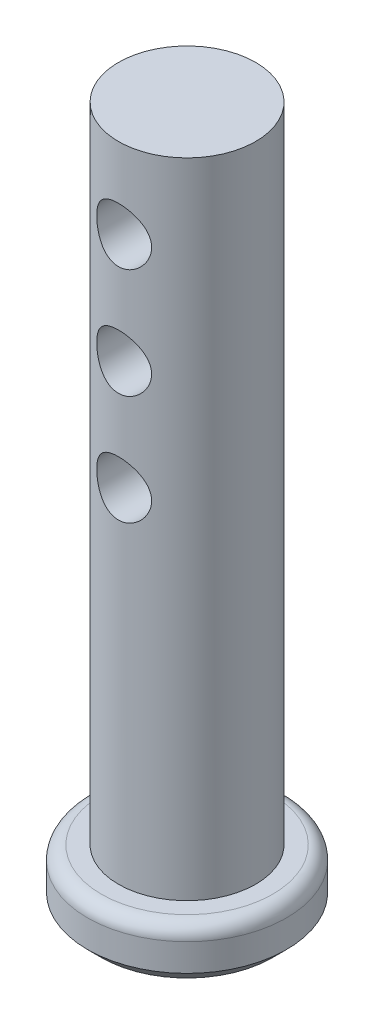
ISO-10303-21;
HEADER;
FILE_DESCRIPTION(('STEP AP214'),'2;1');
FILE_NAME('part.step','',(''),(''),'','','');
FILE_SCHEMA(('AUTOMOTIVE_DESIGN { 1 0 10303 214 1 1 1 1 }'));
ENDSEC;
DATA;
#1=APPLICATION_CONTEXT('core data for automotive mechanical design processes');
#2=APPLICATION_PROTOCOL_DEFINITION('international standard','automotive_design',2000,#1);
#3=PRODUCT_CONTEXT('',#1,'mechanical');
#4=PRODUCT('Part','Part','',(#3));
#5=PRODUCT_RELATED_PRODUCT_CATEGORY('part','',(#4));
#6=PRODUCT_DEFINITION_FORMATION('','',#4);
#7=PRODUCT_DEFINITION_CONTEXT('part definition',#1,'design');
#8=PRODUCT_DEFINITION('design','',#6,#7);
#9=PRODUCT_DEFINITION_SHAPE('','',#8);
#10=(LENGTH_UNIT() NAMED_UNIT(*) SI_UNIT(.MILLI.,.METRE.));
#11=(NAMED_UNIT(*) PLANE_ANGLE_UNIT() SI_UNIT($,.RADIAN.));
#12=(NAMED_UNIT(*) SI_UNIT($,.STERADIAN.) SOLID_ANGLE_UNIT());
#13=UNCERTAINTY_MEASURE_WITH_UNIT(LENGTH_MEASURE(1.E-05),#10,'distance_accuracy_value','');
#14=(GEOMETRIC_REPRESENTATION_CONTEXT(3) GLOBAL_UNCERTAINTY_ASSIGNED_CONTEXT((#13)) GLOBAL_UNIT_ASSIGNED_CONTEXT((#10,
#11,#12)) REPRESENTATION_CONTEXT('',''));
#15=CARTESIAN_POINT('',(0.,0.,0.));
#16=DIRECTION('',(0.,0.,1.));
#17=DIRECTION('',(1.,0.,0.));
#18=AXIS2_PLACEMENT_3D('',#15,#16,#17);
#19=CARTESIAN_POINT('',(0.,2.54,0.));
#20=DIRECTION('',(0.,1.,0.));
#21=DIRECTION('',(0.,0.,1.));
#22=AXIS2_PLACEMENT_3D('',#19,#20,#21);
#23=PLANE('',#22);
#24=CARTESIAN_POINT('',(0.,2.54,0.));
#25=DIRECTION('',(0.,1.,0.));
#26=DIRECTION('',(0.,0.,1.));
#27=AXIS2_PLACEMENT_3D('',#24,#25,#26);
#28=CIRCLE('',#27,3.96875);
#29=CARTESIAN_POINT('',(0.,2.54,3.96875));
#30=VERTEX_POINT('',#29);
#31=EDGE_CURVE('E52',#30,#30,#28,.T.);
#32=ORIENTED_EDGE('',*,*,#31,.T.);
#33=EDGE_LOOP('',(#32));
#34=FACE_BOUND('',#33,.T.);
#35=CARTESIAN_POINT('',(0.,2.54,0.));
#36=DIRECTION('',(0.,1.,0.));
#37=DIRECTION('',(0.,0.,1.));
#38=AXIS2_PLACEMENT_3D('',#35,#36,#37);
#39=CIRCLE('',#38,3.175);
#40=CARTESIAN_POINT('',(0.,2.54,3.175));
#41=VERTEX_POINT('',#40);
#42=EDGE_CURVE('E55',#41,#41,#39,.T.);
#43=ORIENTED_EDGE('',*,*,#42,.F.);
#44=EDGE_LOOP('',(#43));
#45=FACE_BOUND('',#44,.T.);
#46=ADVANCED_FACE('F35',(#34,#45),#23,.T.);
#47=CARTESIAN_POINT('',(0.,2.54,0.));
#48=DIRECTION('',(0.,-1.,0.));
#49=DIRECTION('',(0.,0.,-1.));
#50=AXIS2_PLACEMENT_3D('',#47,#48,#49);
#51=CYLINDRICAL_SURFACE('',#50,4.60375);
#52=CARTESIAN_POINT('',(0.,0.635000000000004,0.));
#53=DIRECTION('',(0.,1.,0.));
#54=DIRECTION('',(0.,0.,1.));
#55=AXIS2_PLACEMENT_3D('',#52,#53,#54);
#56=CIRCLE('',#55,4.60375);
#57=CARTESIAN_POINT('',(0.,0.635000000000004,4.60375));
#58=VERTEX_POINT('',#57);
#59=EDGE_CURVE('E43',#58,#58,#56,.T.);
#60=ORIENTED_EDGE('',*,*,#59,.T.);
#61=EDGE_LOOP('',(#60));
#62=FACE_BOUND('',#61,.T.);
#63=CARTESIAN_POINT('',(0.,1.905,0.));
#64=DIRECTION('',(0.,1.,0.));
#65=DIRECTION('',(0.,0.,1.));
#66=AXIS2_PLACEMENT_3D('',#63,#64,#65);
#67=CIRCLE('',#66,4.60375);
#68=CARTESIAN_POINT('',(0.,1.905,4.60375));
#69=VERTEX_POINT('',#68);
#70=EDGE_CURVE('E47',#69,#69,#67,.F.);
#71=ORIENTED_EDGE('',*,*,#70,.T.);
#72=EDGE_LOOP('',(#71));
#73=FACE_BOUND('',#72,.T.);
#74=ADVANCED_FACE('F126',(#62,#73),#51,.T.);
#75=CARTESIAN_POINT('',(0.,0.,0.));
#76=DIRECTION('',(0.,1.,0.));
#77=DIRECTION('',(0.,0.,1.));
#78=AXIS2_PLACEMENT_3D('',#75,#76,#77);
#79=PLANE('',#78);
#80=CARTESIAN_POINT('',(0.,0.,0.));
#81=DIRECTION('',(0.,1.,0.));
#82=DIRECTION('',(0.,0.,1.));
#83=AXIS2_PLACEMENT_3D('',#80,#81,#82);
#84=CIRCLE('',#83,3.96875);
#85=CARTESIAN_POINT('',(0.,0.,3.96875));
#86=VERTEX_POINT('',#85);
#87=EDGE_CURVE('E10',#86,#86,#84,.F.);
#88=ORIENTED_EDGE('',*,*,#87,.T.);
#89=EDGE_LOOP('',(#88));
#90=FACE_BOUND('',#89,.T.);
#91=ADVANCED_FACE('F110',(#90),#79,.F.);
#92=CARTESIAN_POINT('',(0.,48.26,0.));
#93=DIRECTION('',(0.,-1.,0.));
#94=DIRECTION('',(0.,0.,-1.));
#95=AXIS2_PLACEMENT_3D('',#92,#93,#94);
#96=CYLINDRICAL_SURFACE('',#95,3.175);
#97=CARTESIAN_POINT('',(0.,32.3205337455157,0.));
#98=DIRECTION('',(0.,-1.,0.));
#99=DIRECTION('',(0.,0.,-1.));
#100=AXIS2_PLACEMENT_3D('',#97,#98,#99);
#101=CIRCLE('',#100,3.175);
#102=CARTESIAN_POINT('',(0.,32.3205337455157,-3.175));
#103=VERTEX_POINT('',#102);
#104=EDGE_CURVE('E39',#103,#103,#101,.T.);
#105=ORIENTED_EDGE('',*,*,#104,.T.);
#106=EDGE_LOOP('',(#105));
#107=FACE_BOUND('',#106,.T.);
#108=CARTESIAN_POINT('',(0.,29.845,-3.175));
#109=CARTESIAN_POINT('',(-0.068258058456236,29.8449937440919,-3.17499537229199));
#110=CARTESIAN_POINT('',(-0.136634578197578,29.8394642274239,-3.17277301884902));
#111=CARTESIAN_POINT('',(-0.271460265065364,29.817537708264,-3.16409992718907));
#112=CARTESIAN_POINT('',(-0.337903678751393,29.8011111627803,-3.15763769473787));
#113=CARTESIAN_POINT('',(-0.466695740931903,29.7580836904327,-3.1411812285033));
#114=CARTESIAN_POINT('',(-0.529057020126772,29.7315160726524,-3.13119856591186));
#115=CARTESIAN_POINT('',(-0.648380701158518,29.6690928249377,-3.10868447855509));
#116=CARTESIAN_POINT('',(-0.705344967736885,29.6332404191265,-3.09615393885866));
#117=CARTESIAN_POINT('',(-0.815023139807206,29.5514804584138,-3.06915112718216));
#118=CARTESIAN_POINT('',(-0.867449543069393,29.5052072732875,-3.05461858550036));
#119=CARTESIAN_POINT('',(-0.964041128038309,29.4046909977923,-3.02552466335433));
#120=CARTESIAN_POINT('',(-1.0082022680298,29.3504440312706,-3.01096327228158));
#121=CARTESIAN_POINT('',(-1.08894535023099,29.2325881753962,-2.98273972791181));
#122=CARTESIAN_POINT('',(-1.12510251305914,29.1686700813753,-2.96914643637744));
#123=CARTESIAN_POINT('',(-1.18602424658861,29.0350343870033,-2.94534365963612));
#124=CARTESIAN_POINT('',(-1.21079422832153,28.9653195598163,-2.93513256790051));
#125=CARTESIAN_POINT('',(-1.2470757528564,28.825372668169,-2.91989737114619));
#126=CARTESIAN_POINT('',(-1.25913766828662,28.7553074654091,-2.91465901925808));
#127=CARTESIAN_POINT('',(-1.27137983064145,28.6139667760749,-2.90934142571205));
#128=CARTESIAN_POINT('',(-1.27156592035893,28.5426919019132,-2.90925964706956));
#129=CARTESIAN_POINT('',(-1.26046824836542,28.4062445136242,-2.91408167677795));
#130=CARTESIAN_POINT('',(-1.2499818245838,28.3409925213503,-2.91863891149414));
#131=CARTESIAN_POINT('',(-1.21916626898916,28.2132661819358,-2.93164379130974));
#132=CARTESIAN_POINT('',(-1.19883541970099,28.15079232155,-2.9400921152426));
#133=CARTESIAN_POINT('',(-1.14852115516998,28.0288886740156,-2.96011273031215));
#134=CARTESIAN_POINT('',(-1.11834921257028,27.9695470332003,-2.97174525843298));
#135=CARTESIAN_POINT('',(-1.04934160256501,27.8565509566104,-2.99680703907578));
#136=CARTESIAN_POINT('',(-1.01050268123909,27.8028986680293,-3.01023696565097));
#137=CARTESIAN_POINT('',(-0.921734630653625,27.6984398222108,-3.0386447783134));
#138=CARTESIAN_POINT('',(-0.871180288986414,27.6481738568018,-3.05366207259854));
#139=CARTESIAN_POINT('',(-0.762199661418236,27.5566603564687,-3.08266988848507));
#140=CARTESIAN_POINT('',(-0.703771811487431,27.5154146176445,-3.0966602052278));
#141=CARTESIAN_POINT('',(-0.579169309404779,27.442402920891,-3.12238822602987));
#142=CARTESIAN_POINT('',(-0.512864412005083,27.4108403514399,-3.13407596510587));
#143=CARTESIAN_POINT('',(-0.375300091081701,27.3595034082154,-3.15350415988761));
#144=CARTESIAN_POINT('',(-0.304043204999614,27.3397230461511,-3.16124662048612));
#145=CARTESIAN_POINT('',(-0.163128888631037,27.3136053324085,-3.17154648586888));
#146=CARTESIAN_POINT('',(-0.0936264916808848,27.306541491549,-3.17438370604281));
#147=CARTESIAN_POINT('',(0.0456217717278951,27.3039121811643,-3.17543483854251));
#148=CARTESIAN_POINT('',(0.115367570397124,27.3083437312173,-3.17364994924755));
#149=CARTESIAN_POINT('',(0.249829789342396,27.3280452628705,-3.16584055085484));
#150=CARTESIAN_POINT('',(0.31463138227736,27.3428193175229,-3.16001013504408));
#151=CARTESIAN_POINT('',(0.440775996818531,27.3821116747767,-3.14489745292493));
#152=CARTESIAN_POINT('',(0.502118572992712,27.4066312290896,-3.13561474321398));
#153=CARTESIAN_POINT('',(0.621715028993544,27.4655184366968,-3.11414537679467));
#154=CARTESIAN_POINT('',(0.679817044449623,27.5001643747474,-3.10187858147177));
#155=CARTESIAN_POINT('',(0.789586680441504,27.5780121056801,-3.0757708661341));
#156=CARTESIAN_POINT('',(0.841251708883256,27.6212173272558,-3.06192931625023));
#157=CARTESIAN_POINT('',(0.940259132323243,27.718302458223,-3.03304649700203));
#158=CARTESIAN_POINT('',(0.987090947966796,27.7726987988564,-3.0179863530491));
#159=CARTESIAN_POINT('',(1.07108701035765,27.8888444527109,-2.98920962302381));
#160=CARTESIAN_POINT('',(1.10824966394927,27.9505949752158,-2.97549325859336));
#161=CARTESIAN_POINT('',(1.17208776372654,28.0806281760672,-2.95093580441397));
#162=CARTESIAN_POINT('',(1.19865812752933,28.1489683394998,-2.94012385611842));
#163=CARTESIAN_POINT('',(1.23970809951283,28.2897158688391,-2.92305532658488));
#164=CARTESIAN_POINT('',(1.25419663134598,28.3621201906909,-2.91679538366961));
#165=CARTESIAN_POINT('',(1.26981941697175,28.5033262176268,-2.91002567155455));
#166=CARTESIAN_POINT('',(1.27183964726229,28.5720122231417,-2.9091345234019));
#167=CARTESIAN_POINT('',(1.2647950061412,28.7086959846479,-2.91220420881018));
#168=CARTESIAN_POINT('',(1.25573154232522,28.7766938269281,-2.91616442626245));
#169=CARTESIAN_POINT('',(1.22750031750754,28.9073159405579,-2.92815422165179));
#170=CARTESIAN_POINT('',(1.20874630841755,28.9700463742649,-2.93601668210431));
#171=CARTESIAN_POINT('',(1.16205345979177,29.0914954298045,-2.95480740782763));
#172=CARTESIAN_POINT('',(1.13411208368505,29.1502129382814,-2.96573651965815));
#173=CARTESIAN_POINT('',(1.06798920435241,29.2656321082369,-2.99020617098853));
#174=CARTESIAN_POINT('',(1.02931298782626,29.3220258555328,-3.00386040268909));
#175=CARTESIAN_POINT('',(0.943541495737388,29.4278007564244,-3.03189515776371));
#176=CARTESIAN_POINT('',(0.896443682609497,29.4771797883015,-3.04627589910738));
#177=CARTESIAN_POINT('',(0.791530996483007,29.5708088118224,-3.07526415100495));
#178=CARTESIAN_POINT('',(0.733219260727793,29.6145186898803,-3.08982591305988));
#179=CARTESIAN_POINT('',(0.609536703381468,29.6915440220647,-3.1165825826321));
#180=CARTESIAN_POINT('',(0.544162617887495,29.7248546422168,-3.12877638843996));
#181=CARTESIAN_POINT('',(0.409408669684455,29.7793551066458,-3.14921718908072));
#182=CARTESIAN_POINT('',(0.340126077569508,29.8007591204608,-3.15753345539943));
#183=CARTESIAN_POINT('',(0.198676606888577,29.831435841806,-3.16956634442947));
#184=CARTESIAN_POINT('',(0.126519638920411,29.8407470473324,-3.1732975617973));
#185=CARTESIAN_POINT('',(0.0361393091607415,29.8446160669212,-3.17484696185127));
#186=CARTESIAN_POINT('',(0.0180738073503822,29.8450016564795,-3.17500122535427));
#187=CARTESIAN_POINT('',(0.,29.845,-3.175));
#188=B_SPLINE_CURVE_WITH_KNOTS('',3,(#108,#109,#110,#111,#112,#113,#114,#115,#116,#117,#118,
#119,#120,#121,#122,#123,#124,#125,#126,#127,#128,#129,#130,#131,#132,#133,#134,#135,#136,#137,
#138,#139,#140,#141,#142,#143,#144,#145,#146,#147,#148,#149,#150,#151,#152,#153,#154,#155,#156,
#157,#158,#159,#160,#161,#162,#163,#164,#165,#166,#167,#168,#169,#170,#171,#172,#173,#174,#175,
#176,#177,#178,#179,#180,#181,#182,#183,#184,#185,#186,#187),.UNSPECIFIED.,.T.,.F.,(4,2,2,2,2,2,
2,2,2,2,2,2,2,2,2,2,2,2,2,2,2,2,2,2,2,2,2,2,2,2,2,2,2,2,2,2,2,2,2,4),(0.,0.2047258973121,
0.410009108865038,0.614623775494453,0.819167485156699,1.03249337379752,1.24592330783351,
1.46885189350202,1.691674436801,1.90439106871107,2.1170030452621,2.31481838534871,
2.5126682490759,2.71455595199748,2.91651957930746,3.13409551733464,3.3517147395323,
3.57363339858382,3.79543917132257,4.00411432175285,4.21273537417003,4.41198289283373,
4.61125601111061,4.81662431007897,5.02207504281845,5.24108981386503,5.4601406484278,
5.68131353664425,5.90232292130168,6.10742792604395,6.31250688577534,6.50947592278468,
6.70649938736278,6.91480372216,7.1231709285623,7.34504768943986,7.56702743411739,
7.78487331143458,8.00202395276757,8.05623259144465),.UNSPECIFIED.);
#189=CARTESIAN_POINT('',(0.,29.845,-3.175));
#190=VERTEX_POINT('',#189);
#191=EDGE_CURVE('E56',#190,#190,#188,.T.);
#192=ORIENTED_EDGE('',*,*,#191,.T.);
#193=EDGE_LOOP('',(#192));
#194=FACE_BOUND('',#193,.T.);
#195=CARTESIAN_POINT('',(1.26999999999997,28.575,2.90993556629697));
#196=CARTESIAN_POINT('',(1.26999254141937,28.5069664187066,2.90994243801829));
#197=CARTESIAN_POINT('',(1.26450078480738,28.4388366104625,2.9123551257751));
#198=CARTESIAN_POINT('',(1.24273883442635,28.3045313811231,2.92170430509283));
#199=CARTESIAN_POINT('',(1.22644109832072,28.2383614066539,2.92865235570652));
#200=CARTESIAN_POINT('',(1.18378924568109,28.110146381849,2.94614889427475));
#201=CARTESIAN_POINT('',(1.15747301685361,28.0480868124262,2.95668380186769));
#202=CARTESIAN_POINT('',(1.09564187105094,27.9292779927041,2.98014812335504));
#203=CARTESIAN_POINT('',(1.06012896258483,27.8725275865892,2.99307701423992));
#204=CARTESIAN_POINT('',(0.978739453862976,27.7626696445767,3.02070049307407));
#205=CARTESIAN_POINT('',(0.932420892156818,27.7099036714398,3.03545187903805));
#206=CARTESIAN_POINT('',(0.831665282166482,27.6126390867047,3.06458910181546));
#207=CARTESIAN_POINT('',(0.777225408764021,27.5681433641809,3.07897480937597));
#208=CARTESIAN_POINT('',(0.659134007076263,27.486986937916,3.10644164020853));
#209=CARTESIAN_POINT('',(0.595203893163761,27.4507043685661,3.11944895339067));
#210=CARTESIAN_POINT('',(0.461534080025664,27.3895543340725,3.14200494046033));
#211=CARTESIAN_POINT('',(0.391796758497819,27.3646822239285,3.15155502139268));
#212=CARTESIAN_POINT('',(0.25207368104266,27.3282781561123,3.16571836380261));
#213=CARTESIAN_POINT('',(0.182263405350889,27.3161586555535,3.17054824852352));
#214=CARTESIAN_POINT('',(0.0414441186848736,27.3037119116042,3.17550997283516));
#215=CARTESIAN_POINT('',(-0.0295644352991653,27.3033802699814,3.17564356468514));
#216=CARTESIAN_POINT('',(-0.166517634144258,27.3141965588071,3.17132946391834));
#217=CARTESIAN_POINT('',(-0.232522682575047,27.3247007306943,3.16713867950116));
#218=CARTESIAN_POINT('',(-0.36174242435368,27.3557954764573,3.15499300082681));
#219=CARTESIAN_POINT('',(-0.424956912587786,27.3763867904242,3.14703783037906));
#220=CARTESIAN_POINT('',(-0.547940190954937,27.4273241666265,3.12798983530639));
#221=CARTESIAN_POINT('',(-0.607642690846103,27.4578125689079,3.11685152896417));
#222=CARTESIAN_POINT('',(-0.721238175720301,27.5275452793936,3.09254261589107));
#223=CARTESIAN_POINT('',(-0.775129160124765,27.566792588617,3.07937131308321));
#224=CARTESIAN_POINT('',(-0.879328205775052,27.6559322013261,3.05131239608241));
#225=CARTESIAN_POINT('',(-0.929168731748799,27.7063542217907,3.03636887340351));
#226=CARTESIAN_POINT('',(-1.01987820876972,27.8148990131063,3.00711654712633));
#227=CARTESIAN_POINT('',(-1.06074422328742,27.8730242945779,2.99280795249979));
#228=CARTESIAN_POINT('',(-1.1334141598518,27.9974160792297,2.96606529875549));
#229=CARTESIAN_POINT('',(-1.1649295038517,28.0638661673572,2.95369560505175));
#230=CARTESIAN_POINT('',(-1.21613692507861,28.2017568364434,2.93298619946749));
#231=CARTESIAN_POINT('',(-1.23583668148683,28.2731941423295,2.92464387081319));
#232=CARTESIAN_POINT('',(-1.26171639250833,28.4143677186719,2.91356897392077));
#233=CARTESIAN_POINT('',(-1.26864878147337,28.4839412839213,2.91052482694526));
#234=CARTESIAN_POINT('',(-1.27099144229516,28.6233090269327,2.90950331151956));
#235=CARTESIAN_POINT('',(-1.26640520822651,28.6931031313814,2.91152440657163));
#236=CARTESIAN_POINT('',(-1.24652588819075,28.8267514236964,2.92008588166777));
#237=CARTESIAN_POINT('',(-1.23185749438493,28.8907175152487,2.92636230701582));
#238=CARTESIAN_POINT('',(-1.1930406586887,29.0152381370391,2.94239982402697));
#239=CARTESIAN_POINT('',(-1.16889011478205,29.0757919074231,2.95216168830351));
#240=CARTESIAN_POINT('',(-1.11070113107076,29.1945074972001,2.97455451481067));
#241=CARTESIAN_POINT('',(-1.07630142134805,29.252472729821,2.98728577445849));
#242=CARTESIAN_POINT('',(-0.998959917520622,29.3620716970255,3.01402994575226));
#243=CARTESIAN_POINT('',(-0.956014644661092,29.4137028392252,3.02804337808999));
#244=CARTESIAN_POINT('',(-0.85905607441714,29.5131321144605,3.05702281641836));
#245=CARTESIAN_POINT('',(-0.804459547697671,29.5603654189598,3.07198272626102));
#246=CARTESIAN_POINT('',(-0.687758107189249,29.6450874436476,3.10019569550402));
#247=CARTESIAN_POINT('',(-0.625652887927127,29.6825757671892,3.11344868541707));
#248=CARTESIAN_POINT('',(-0.495477758091151,29.7466052428029,3.13679659596681));
#249=CARTESIAN_POINT('',(-0.427409280431264,29.7731490160453,3.14689227262573));
#250=CARTESIAN_POINT('',(-0.28726993023374,29.8142335212788,3.16276173052999));
#251=CARTESIAN_POINT('',(-0.215201252536894,29.8287807674144,3.1685378571429));
#252=CARTESIAN_POINT('',(-0.0741784840699358,29.8446854855321,3.17486670213675));
#253=CARTESIAN_POINT('',(-0.00532796279662326,29.8468415815738,3.17573562682994));
#254=CARTESIAN_POINT('',(0.131720485690577,29.8400117706546,3.17300636910406));
#255=CARTESIAN_POINT('',(0.199918510115553,29.8310275503061,3.1694088628899));
#256=CARTESIAN_POINT('',(0.331578522735939,29.8027427893924,3.15830910986302));
#257=CARTESIAN_POINT('',(0.395121640951693,29.783767619242,3.150930202028));
#258=CARTESIAN_POINT('',(0.518110695271896,29.7363814691032,3.13305791873344));
#259=CARTESIAN_POINT('',(0.577555873249689,29.7079687487771,3.12256396888048));
#260=CARTESIAN_POINT('',(0.6935489315786,29.6410994689593,3.09891489918637));
#261=CARTESIAN_POINT('',(0.749852695622046,29.602254552748,3.08566267377427));
#262=CARTESIAN_POINT('',(0.855379308112752,29.5162042903214,3.05809271023395));
#263=CARTESIAN_POINT('',(0.904599210448522,29.4689954837478,3.04377453252069));
#264=CARTESIAN_POINT('',(0.997712803329573,29.3641048324266,3.01458479860234));
#265=CARTESIAN_POINT('',(1.04108814337135,29.3059555653903,2.9997338570442));
#266=CARTESIAN_POINT('',(1.11750313102899,29.1827317427327,2.97211541386741));
#267=CARTESIAN_POINT('',(1.15054156346646,29.1176563741022,2.95934815728535));
#268=CARTESIAN_POINT('',(1.20268434067252,28.9883613768265,2.93851878930773));
#269=CARTESIAN_POINT('',(1.22277347149424,28.924589575933,2.93013713318398));
#270=CARTESIAN_POINT('',(1.25267577621464,28.7944017585347,2.91748212288518));
#271=CARTESIAN_POINT('',(1.26251758410886,28.727993651361,2.91319732365833));
#272=CARTESIAN_POINT('',(1.26902480402693,28.6325452479154,2.91036031311099));
#273=CARTESIAN_POINT('',(1.27000315531172,28.6037812346665,2.90993265925283));
#274=CARTESIAN_POINT('',(1.26999999999997,28.575,2.90993556629697));
#275=B_SPLINE_CURVE_WITH_KNOTS('',3,(#195,#196,#197,#198,#199,#200,#201,#202,#203,#204,#205,
#206,#207,#208,#209,#210,#211,#212,#213,#214,#215,#216,#217,#218,#219,#220,#221,#222,#223,#224,
#225,#226,#227,#228,#229,#230,#231,#232,#233,#234,#235,#236,#237,#238,#239,#240,#241,#242,#243,
#244,#245,#246,#247,#248,#249,#250,#251,#252,#253,#254,#255,#256,#257,#258,#259,#260,#261,#262,
#263,#264,#265,#266,#267,#268,#269,#270,#271,#272,#273,#274),.UNSPECIFIED.,.T.,.F.,(4,2,2,2,2,2,
2,2,2,2,2,2,2,2,2,2,2,2,2,2,2,2,2,2,2,2,2,2,2,2,2,2,2,2,2,2,2,2,2,4),(0.,0.204011306967464,
0.408544608247129,0.612311972791306,0.816034873031526,1.0303231761061,1.24468619711198,
1.46750194873057,1.6902269152562,1.90216906133362,2.11403212769102,2.31399489467242,
2.51397233506953,2.71696370649161,2.9200247348692,3.13641767991661,3.35288132525726,
3.57545931283757,3.79789248544261,4.00673663674204,4.21551744462738,4.41240702530263,
4.60934027739986,4.81425983200662,5.01926297720111,5.23940871243028,5.45956340677691,
5.67966534439832,5.89964768727073,6.10527760241227,6.31087638956699,6.51015966467725,
6.70947970917348,6.91760777470049,7.12582215014467,7.34692620832561,7.56805624913281,
7.7693307961631,7.97004140185417,8.05634727005666),.UNSPECIFIED.);
#276=CARTESIAN_POINT('',(1.26999999999997,28.575,2.90993556629697));
#277=VERTEX_POINT('',#276);
#278=EDGE_CURVE('E64',#277,#277,#275,.T.);
#279=ORIENTED_EDGE('',*,*,#278,.T.);
#280=EDGE_LOOP('',(#279));
#281=FACE_BOUND('',#280,.T.);
#282=CARTESIAN_POINT('',(0.,24.765,-3.175));
#283=CARTESIAN_POINT('',(-0.0682580584562359,24.7649937440919,-3.17499537229199));
#284=CARTESIAN_POINT('',(-0.136634578197577,24.7594642274239,-3.17277301884902));
#285=CARTESIAN_POINT('',(-0.271460265065364,24.737537708264,-3.16409992718907));
#286=CARTESIAN_POINT('',(-0.337903678751393,24.7211111627803,-3.15763769473787));
#287=CARTESIAN_POINT('',(-0.466695740931902,24.6780836904327,-3.1411812285033));
#288=CARTESIAN_POINT('',(-0.529057020126771,24.6515160726524,-3.13119856591186));
#289=CARTESIAN_POINT('',(-0.648380701158516,24.5890928249377,-3.1086844785551));
#290=CARTESIAN_POINT('',(-0.705344967736883,24.5532404191265,-3.09615393885866));
#291=CARTESIAN_POINT('',(-0.815023139807204,24.4714804584138,-3.06915112718216));
#292=CARTESIAN_POINT('',(-0.867449543069391,24.4252072732874,-3.05461858550036));
#293=CARTESIAN_POINT('',(-0.964041128038305,24.3246909977923,-3.02552466335433));
#294=CARTESIAN_POINT('',(-1.0082022680298,24.2704440312706,-3.01096327228158));
#295=CARTESIAN_POINT('',(-1.08894535023099,24.1525881753962,-2.98273972791181));
#296=CARTESIAN_POINT('',(-1.12510251305914,24.0886700813753,-2.96914643637744));
#297=CARTESIAN_POINT('',(-1.1860242465886,23.9550343870033,-2.94534365963613));
#298=CARTESIAN_POINT('',(-1.21079422832152,23.8853195598163,-2.93513256790051));
#299=CARTESIAN_POINT('',(-1.24707575285639,23.745372668169,-2.91989737114619));
#300=CARTESIAN_POINT('',(-1.2591376682866,23.6753074654091,-2.91465901925808));
#301=CARTESIAN_POINT('',(-1.27137983064144,23.5339667760749,-2.90934142571206));
#302=CARTESIAN_POINT('',(-1.27156592035891,23.4626919019131,-2.90925964706957));
#303=CARTESIAN_POINT('',(-1.26046824836541,23.3262445136242,-2.91408167677795));
#304=CARTESIAN_POINT('',(-1.24998182458378,23.2609925213503,-2.91863891149415));
#305=CARTESIAN_POINT('',(-1.21916626898914,23.1332661819358,-2.93164379130975));
#306=CARTESIAN_POINT('',(-1.19883541970096,23.07079232155,-2.94009211524261));
#307=CARTESIAN_POINT('',(-1.14852115516996,22.9488886740155,-2.96011273031216));
#308=CARTESIAN_POINT('',(-1.11834921257025,22.8895470332003,-2.97174525843299));
#309=CARTESIAN_POINT('',(-1.04934160256498,22.7765509566104,-2.99680703907579));
#310=CARTESIAN_POINT('',(-1.01050268123907,22.7228986680292,-3.01023696565098));
#311=CARTESIAN_POINT('',(-0.921734630653596,22.6184398222107,-3.03864477831341));
#312=CARTESIAN_POINT('',(-0.871180288986385,22.5681738568018,-3.05366207259855));
#313=CARTESIAN_POINT('',(-0.762199661418206,22.4766603564687,-3.08266988848508));
#314=CARTESIAN_POINT('',(-0.703771811487399,22.4354146176445,-3.0966602052278));
#315=CARTESIAN_POINT('',(-0.579169309404745,22.362402920891,-3.12238822602988));
#316=CARTESIAN_POINT('',(-0.512864412005048,22.3308403514399,-3.13407596510588));
#317=CARTESIAN_POINT('',(-0.375300091081666,22.2795034082154,-3.15350415988761));
#318=CARTESIAN_POINT('',(-0.30404320499958,22.2597230461511,-3.16124662048612));
#319=CARTESIAN_POINT('',(-0.163128888631002,22.2336053324085,-3.17154648586888));
#320=CARTESIAN_POINT('',(-0.0936264916808505,22.226541491549,-3.17438370604281));
#321=CARTESIAN_POINT('',(0.0456217717279294,22.2239121811643,-3.17543483854251));
#322=CARTESIAN_POINT('',(0.115367570397158,22.2283437312173,-3.17364994924755));
#323=CARTESIAN_POINT('',(0.24982978934243,22.2480452628705,-3.16584055085483));
#324=CARTESIAN_POINT('',(0.314631382277395,22.2628193175229,-3.16001013504408));
#325=CARTESIAN_POINT('',(0.440775996818565,22.3021116747767,-3.14489745292493));
#326=CARTESIAN_POINT('',(0.502118572992746,22.3266312290896,-3.13561474321397));
#327=CARTESIAN_POINT('',(0.621715028993576,22.3855184366968,-3.11414537679466));
#328=CARTESIAN_POINT('',(0.679817044449653,22.4201643747474,-3.10187858147176));
#329=CARTESIAN_POINT('',(0.789586680441534,22.4980121056801,-3.07577086613409));
#330=CARTESIAN_POINT('',(0.841251708883286,22.5412173272559,-3.06192931625022));
#331=CARTESIAN_POINT('',(0.940259132323273,22.638302458223,-3.03304649700202));
#332=CARTESIAN_POINT('',(0.987090947966825,22.6926987988564,-3.01798635304909));
#333=CARTESIAN_POINT('',(1.07108701035768,22.8088444527109,-2.9892096230238));
#334=CARTESIAN_POINT('',(1.10824966394929,22.8705949752159,-2.97549325859335));
#335=CARTESIAN_POINT('',(1.17208776372656,23.0006281760672,-2.95093580441396));
#336=CARTESIAN_POINT('',(1.19865812752936,23.0689683394998,-2.94012385611841));
#337=CARTESIAN_POINT('',(1.23970809951285,23.2097158688391,-2.92305532658487));
#338=CARTESIAN_POINT('',(1.254196631346,23.2821201906909,-2.9167953836696));
#339=CARTESIAN_POINT('',(1.26981941697177,23.4233262176268,-2.91002567155454));
#340=CARTESIAN_POINT('',(1.27183964726231,23.4920122231418,-2.90913452340189));
#341=CARTESIAN_POINT('',(1.26479500614122,23.6286959846479,-2.91220420881018));
#342=CARTESIAN_POINT('',(1.25573154232524,23.6966938269281,-2.91616442626244));
#343=CARTESIAN_POINT('',(1.22750031750756,23.8273159405579,-2.92815422165178));
#344=CARTESIAN_POINT('',(1.20874630841756,23.8900463742649,-2.93601668210431));
#345=CARTESIAN_POINT('',(1.16205345979179,24.0114954298046,-2.95480740782763));
#346=CARTESIAN_POINT('',(1.13411208368506,24.0702129382814,-2.96573651965815));
#347=CARTESIAN_POINT('',(1.06798920435242,24.1856321082369,-2.99020617098852));
#348=CARTESIAN_POINT('',(1.02931298782627,24.2420258555328,-3.00386040268909));
#349=CARTESIAN_POINT('',(0.943541495737396,24.3478007564244,-3.03189515776371));
#350=CARTESIAN_POINT('',(0.896443682609506,24.3971797883015,-3.04627589910738));
#351=CARTESIAN_POINT('',(0.791530996483015,24.4908088118224,-3.07526415100495));
#352=CARTESIAN_POINT('',(0.733219260727799,24.5345186898803,-3.08982591305988));
#353=CARTESIAN_POINT('',(0.609536703381472,24.6115440220647,-3.1165825826321));
#354=CARTESIAN_POINT('',(0.544162617887499,24.6448546422168,-3.12877638843995));
#355=CARTESIAN_POINT('',(0.409408669684458,24.6993551066458,-3.14921718908072));
#356=CARTESIAN_POINT('',(0.34012607756951,24.7207591204608,-3.15753345539943));
#357=CARTESIAN_POINT('',(0.198676606888578,24.751435841806,-3.16956634442947));
#358=CARTESIAN_POINT('',(0.126519638920412,24.7607470473324,-3.1732975617973));
#359=CARTESIAN_POINT('',(0.0361393091607421,24.7646160669212,-3.17484696185127));
#360=CARTESIAN_POINT('',(0.0180738073503825,24.7650016564795,-3.17500122535427));
#361=CARTESIAN_POINT('',(0.,24.765,-3.175));
#362=B_SPLINE_CURVE_WITH_KNOTS('',3,(#282,#283,#284,#285,#286,#287,#288,#289,#290,#291,#292,
#293,#294,#295,#296,#297,#298,#299,#300,#301,#302,#303,#304,#305,#306,#307,#308,#309,#310,#311,
#312,#313,#314,#315,#316,#317,#318,#319,#320,#321,#322,#323,#324,#325,#326,#327,#328,#329,#330,
#331,#332,#333,#334,#335,#336,#337,#338,#339,#340,#341,#342,#343,#344,#345,#346,#347,#348,#349,
#350,#351,#352,#353,#354,#355,#356,#357,#358,#359,#360,#361),.UNSPECIFIED.,.T.,.F.,(4,2,2,2,2,2,
2,2,2,2,2,2,2,2,2,2,2,2,2,2,2,2,2,2,2,2,2,2,2,2,2,2,2,2,2,2,2,2,2,4),(0.,0.2047258973121,
0.410009108865038,0.614623775494455,0.819167485156701,1.03249337379752,1.24592330783351,
1.46885189350203,1.691674436801,1.90439106871106,2.1170030452621,2.31481838534871,
2.5126682490759,2.71455595199748,2.91651957930746,3.13409551733463,3.3517147395323,
3.57363339858382,3.79543917132257,4.00411432175285,4.21273537417003,4.41198289283373,
4.61125601111061,4.81662431007897,5.02207504281846,5.24108981386503,5.4601406484278,
5.68131353664426,5.90232292130168,6.10742792604395,6.31250688577534,6.50947592278469,
6.70649938736279,6.91480372216,7.1231709285623,7.34504768943986,7.56702743411739,
7.78487331143458,8.00202395276758,8.05623259144466),.UNSPECIFIED.);
#363=CARTESIAN_POINT('',(0.,24.765,-3.175));
#364=VERTEX_POINT('',#363);
#365=EDGE_CURVE('E92',#364,#364,#362,.T.);
#366=ORIENTED_EDGE('',*,*,#365,.T.);
#367=EDGE_LOOP('',(#366));
#368=FACE_BOUND('',#367,.T.);
#369=CARTESIAN_POINT('',(1.26999999999999,23.495,2.90993556629696));
#370=CARTESIAN_POINT('',(1.26999254141939,23.4269664187066,2.90994243801828));
#371=CARTESIAN_POINT('',(1.2645007848074,23.3588366104625,2.91235512577509));
#372=CARTESIAN_POINT('',(1.24273883442637,23.2245313811231,2.92170430509282));
#373=CARTESIAN_POINT('',(1.22644109832074,23.1583614066539,2.92865235570651));
#374=CARTESIAN_POINT('',(1.18378924568111,23.030146381849,2.94614889427474));
#375=CARTESIAN_POINT('',(1.15747301685363,22.9680868124262,2.95668380186769));
#376=CARTESIAN_POINT('',(1.09564187105096,22.8492779927041,2.98014812335504));
#377=CARTESIAN_POINT('',(1.06012896258485,22.7925275865892,2.99307701423992));
#378=CARTESIAN_POINT('',(0.978739453862995,22.6826696445767,3.02070049307406));
#379=CARTESIAN_POINT('',(0.932420892156837,22.6299036714398,3.03545187903804));
#380=CARTESIAN_POINT('',(0.831665282166501,22.5326390867047,3.06458910181545));
#381=CARTESIAN_POINT('',(0.77722540876404,22.4881433641809,3.07897480937597));
#382=CARTESIAN_POINT('',(0.659134007076283,22.406986937916,3.10644164020853));
#383=CARTESIAN_POINT('',(0.595203893163782,22.3707043685661,3.11944895339066));
#384=CARTESIAN_POINT('',(0.461534080025684,22.3095543340725,3.14200494046032));
#385=CARTESIAN_POINT('',(0.391796758497838,22.2846822239285,3.15155502139268));
#386=CARTESIAN_POINT('',(0.252073681042678,22.2482781561123,3.16571836380261));
#387=CARTESIAN_POINT('',(0.182263405350906,22.2361586555535,3.17054824852352));
#388=CARTESIAN_POINT('',(0.0414441186848899,22.2237119116042,3.17550997283516));
#389=CARTESIAN_POINT('',(-0.0295644352991496,22.2233802699814,3.17564356468514));
#390=CARTESIAN_POINT('',(-0.166517634144242,22.2341965588071,3.17132946391834));
#391=CARTESIAN_POINT('',(-0.23252268257503,22.2447007306943,3.16713867950116));
#392=CARTESIAN_POINT('',(-0.361742424353662,22.2757954764573,3.15499300082682));
#393=CARTESIAN_POINT('',(-0.424956912587768,22.2963867904242,3.14703783037906));
#394=CARTESIAN_POINT('',(-0.54794019095492,22.3473241666265,3.12798983530639));
#395=CARTESIAN_POINT('',(-0.607642690846087,22.3778125689079,3.11685152896418));
#396=CARTESIAN_POINT('',(-0.721238175720284,22.4475452793936,3.09254261589108));
#397=CARTESIAN_POINT('',(-0.775129160124747,22.486792588617,3.07937131308321));
#398=CARTESIAN_POINT('',(-0.879328205775035,22.5759322013261,3.05131239608241));
#399=CARTESIAN_POINT('',(-0.929168731748782,22.6263542217907,3.03636887340352));
#400=CARTESIAN_POINT('',(-1.0198782087697,22.7348990131063,3.00711654712634));
#401=CARTESIAN_POINT('',(-1.0607442232874,22.7930242945779,2.9928079524998));
#402=CARTESIAN_POINT('',(-1.13341415985178,22.9174160792297,2.9660652987555));
#403=CARTESIAN_POINT('',(-1.16492950385168,22.9838661673572,2.95369560505176));
#404=CARTESIAN_POINT('',(-1.2161369250786,23.1217568364434,2.9329861994675));
#405=CARTESIAN_POINT('',(-1.23583668148681,23.1931941423295,2.9246438708132));
#406=CARTESIAN_POINT('',(-1.26171639250831,23.3343677186719,2.91356897392078));
#407=CARTESIAN_POINT('',(-1.26864878147336,23.4039412839213,2.91052482694527));
#408=CARTESIAN_POINT('',(-1.27099144229514,23.5433090269327,2.90950331151957));
#409=CARTESIAN_POINT('',(-1.2664052082265,23.6131031313814,2.91152440657163));
#410=CARTESIAN_POINT('',(-1.24652588819073,23.7467514236964,2.92008588166778));
#411=CARTESIAN_POINT('',(-1.23185749438491,23.8107175152487,2.92636230701583));
#412=CARTESIAN_POINT('',(-1.19304065868868,23.9352381370391,2.94239982402698));
#413=CARTESIAN_POINT('',(-1.16889011478204,23.9957919074232,2.95216168830352));
#414=CARTESIAN_POINT('',(-1.11070113107074,24.1145074972001,2.97455451481068));
#415=CARTESIAN_POINT('',(-1.07630142134803,24.172472729821,2.9872857744585));
#416=CARTESIAN_POINT('',(-0.998959917520607,24.2820716970255,3.01402994575226));
#417=CARTESIAN_POINT('',(-0.956014644661076,24.3337028392252,3.02804337808999));
#418=CARTESIAN_POINT('',(-0.859056074417124,24.4331321144605,3.05702281641837));
#419=CARTESIAN_POINT('',(-0.804459547697655,24.4803654189598,3.07198272626103));
#420=CARTESIAN_POINT('',(-0.687758107189232,24.5650874436476,3.10019569550402));
#421=CARTESIAN_POINT('',(-0.625652887927109,24.6025757671892,3.11344868541707));
#422=CARTESIAN_POINT('',(-0.495477758091133,24.6666052428029,3.13679659596681));
#423=CARTESIAN_POINT('',(-0.427409280431247,24.6931490160453,3.14689227262574));
#424=CARTESIAN_POINT('',(-0.287269930233723,24.7342335212789,3.16276173052999));
#425=CARTESIAN_POINT('',(-0.215201252536875,24.7487807674144,3.1685378571429));
#426=CARTESIAN_POINT('',(-0.0741784840699162,24.7646854855321,3.17486670213675));
#427=CARTESIAN_POINT('',(-0.00532796279660385,24.7668415815738,3.17573562682994));
#428=CARTESIAN_POINT('',(0.131720485690596,24.7600117706546,3.17300636910406));
#429=CARTESIAN_POINT('',(0.199918510115572,24.7510275503061,3.16940886288989));
#430=CARTESIAN_POINT('',(0.331578522735958,24.7227427893924,3.15830910986302));
#431=CARTESIAN_POINT('',(0.395121640951712,24.703767619242,3.150930202028));
#432=CARTESIAN_POINT('',(0.518110695271914,24.6563814691032,3.13305791873344));
#433=CARTESIAN_POINT('',(0.577555873249707,24.6279687487771,3.12256396888048));
#434=CARTESIAN_POINT('',(0.69354893157862,24.5610994689593,3.09891489918637));
#435=CARTESIAN_POINT('',(0.749852695622068,24.522254552748,3.08566267377426));
#436=CARTESIAN_POINT('',(0.855379308112774,24.4362042903214,3.05809271023394));
#437=CARTESIAN_POINT('',(0.904599210448542,24.3889954837478,3.04377453252068));
#438=CARTESIAN_POINT('',(0.997712803329591,24.2841048324266,3.01458479860234));
#439=CARTESIAN_POINT('',(1.04108814337137,24.2259555653903,2.99973385704419));
#440=CARTESIAN_POINT('',(1.117503131029,24.1027317427327,2.9721154138674));
#441=CARTESIAN_POINT('',(1.15054156346648,24.0376563741022,2.95934815728535));
#442=CARTESIAN_POINT('',(1.20268434067254,23.9083613768265,2.93851878930772));
#443=CARTESIAN_POINT('',(1.22277347149426,23.844589575933,2.93013713318397));
#444=CARTESIAN_POINT('',(1.25267577621466,23.7144017585347,2.91748212288518));
#445=CARTESIAN_POINT('',(1.26251758410888,23.647993651361,2.91319732365832));
#446=CARTESIAN_POINT('',(1.26902480402695,23.5525452479154,2.91036031311099));
#447=CARTESIAN_POINT('',(1.27000315531173,23.5237812346665,2.90993265925282));
#448=CARTESIAN_POINT('',(1.26999999999999,23.495,2.90993556629696));
#449=B_SPLINE_CURVE_WITH_KNOTS('',3,(#369,#370,#371,#372,#373,#374,#375,#376,#377,#378,#379,
#380,#381,#382,#383,#384,#385,#386,#387,#388,#389,#390,#391,#392,#393,#394,#395,#396,#397,#398,
#399,#400,#401,#402,#403,#404,#405,#406,#407,#408,#409,#410,#411,#412,#413,#414,#415,#416,#417,
#418,#419,#420,#421,#422,#423,#424,#425,#426,#427,#428,#429,#430,#431,#432,#433,#434,#435,#436,
#437,#438,#439,#440,#441,#442,#443,#444,#445,#446,#447,#448),.UNSPECIFIED.,.T.,.F.,(4,2,2,2,2,2,
2,2,2,2,2,2,2,2,2,2,2,2,2,2,2,2,2,2,2,2,2,2,2,2,2,2,2,2,2,2,2,2,2,4),(0.,0.204011306967464,
0.408544608247129,0.612311972791306,0.816034873031523,1.0303231761061,1.24468619711198,
1.46750194873057,1.6902269152562,1.90216906133362,2.11403212769102,2.31399489467242,
2.51397233506953,2.71696370649161,2.9200247348692,3.13641767991662,3.35288132525727,
3.57545931283757,3.79789248544262,4.00673663674205,4.21551744462739,4.41240702530264,
4.60934027739987,4.81425983200662,5.01926297720111,5.23940871243029,5.45956340677692,
5.67966534439833,5.89964768727074,6.10527760241227,6.31087638956699,6.51015966467726,
6.70947970917349,6.9176077747005,7.12582215014468,7.34692620832562,7.56805624913282,
7.76933079616311,7.97004140185417,8.05634727005667),.UNSPECIFIED.);
#450=CARTESIAN_POINT('',(1.26999999999999,23.495,2.90993556629696));
#451=VERTEX_POINT('',#450);
#452=EDGE_CURVE('E63',#451,#451,#449,.T.);
#453=ORIENTED_EDGE('',*,*,#452,.T.);
#454=EDGE_LOOP('',(#453));
#455=FACE_BOUND('',#454,.T.);
#456=CARTESIAN_POINT('',(0.,19.685,-3.175));
#457=CARTESIAN_POINT('',(-0.0682580584562362,19.6849937440919,-3.17499537229199));
#458=CARTESIAN_POINT('',(-0.136634578197578,19.6794642274239,-3.17277301884902));
#459=CARTESIAN_POINT('',(-0.271460265065364,19.657537708264,-3.16409992718907));
#460=CARTESIAN_POINT('',(-0.337903678751393,19.6411111627803,-3.15763769473787));
#461=CARTESIAN_POINT('',(-0.466695740931901,19.5980836904326,-3.1411812285033));
#462=CARTESIAN_POINT('',(-0.529057020126769,19.5715160726524,-3.13119856591186));
#463=CARTESIAN_POINT('',(-0.648380701158513,19.5090928249376,-3.1086844785551));
#464=CARTESIAN_POINT('',(-0.70534496773688,19.4732404191265,-3.09615393885866));
#465=CARTESIAN_POINT('',(-0.8150231398072,19.3914804584138,-3.06915112718216));
#466=CARTESIAN_POINT('',(-0.867449543069385,19.3452072732874,-3.05461858550036));
#467=CARTESIAN_POINT('',(-0.964041128038298,19.2446909977922,-3.02552466335433));
#468=CARTESIAN_POINT('',(-1.00820226802979,19.1904440312705,-3.01096327228158));
#469=CARTESIAN_POINT('',(-1.08894535023098,19.0725881753962,-2.98273972791182));
#470=CARTESIAN_POINT('',(-1.12510251305913,19.0086700813753,-2.96914643637744));
#471=CARTESIAN_POINT('',(-1.18602424658859,18.8750343870033,-2.94534365963613));
#472=CARTESIAN_POINT('',(-1.21079422832151,18.8053195598163,-2.93513256790052));
#473=CARTESIAN_POINT('',(-1.24707575285638,18.665372668169,-2.9198973711462));
#474=CARTESIAN_POINT('',(-1.25913766828659,18.5953074654091,-2.91465901925809));
#475=CARTESIAN_POINT('',(-1.27137983064142,18.4539667760749,-2.90934142571206));
#476=CARTESIAN_POINT('',(-1.2715659203589,18.3826919019131,-2.90925964706958));
#477=CARTESIAN_POINT('',(-1.26046824836538,18.2462445136241,-2.91408167677796));
#478=CARTESIAN_POINT('',(-1.24998182458376,18.1809925213503,-2.91863891149416));
#479=CARTESIAN_POINT('',(-1.21916626898911,18.0532661819357,-2.93164379130976));
#480=CARTESIAN_POINT('',(-1.19883541970094,17.99079232155,-2.94009211524262));
#481=CARTESIAN_POINT('',(-1.14852115516993,17.8688886740155,-2.96011273031217));
#482=CARTESIAN_POINT('',(-1.11834921257022,17.8095470332003,-2.971745258433));
#483=CARTESIAN_POINT('',(-1.04934160256495,17.6965509566104,-2.9968070390758));
#484=CARTESIAN_POINT('',(-1.01050268123903,17.6428986680292,-3.01023696565099));
#485=CARTESIAN_POINT('',(-0.92173463065356,17.5384398222107,-3.03864477831342));
#486=CARTESIAN_POINT('',(-0.871180288986348,17.4881738568018,-3.05366207259856));
#487=CARTESIAN_POINT('',(-0.762199661418168,17.3966603564687,-3.08266988848509));
#488=CARTESIAN_POINT('',(-0.703771811487361,17.3554146176445,-3.09666020522781));
#489=CARTESIAN_POINT('',(-0.579169309404706,17.2824029208909,-3.12238822602988));
#490=CARTESIAN_POINT('',(-0.512864412005009,17.2508403514399,-3.13407596510588));
#491=CARTESIAN_POINT('',(-0.375300091081626,17.1995034082154,-3.15350415988762));
#492=CARTESIAN_POINT('',(-0.304043204999539,17.179723046151,-3.16124662048613));
#493=CARTESIAN_POINT('',(-0.163128888630962,17.1536053324085,-3.17154648586888));
#494=CARTESIAN_POINT('',(-0.0936264916808105,17.146541491549,-3.17438370604281));
#495=CARTESIAN_POINT('',(0.045621771727968,17.1439121811643,-3.17543483854251));
#496=CARTESIAN_POINT('',(0.115367570397196,17.1483437312173,-3.17364994924755));
#497=CARTESIAN_POINT('',(0.249829789342467,17.1680452628705,-3.16584055085483));
#498=CARTESIAN_POINT('',(0.314631382277431,17.1828193175229,-3.16001013504407));
#499=CARTESIAN_POINT('',(0.4407759968186,17.2221116747767,-3.14489745292492));
#500=CARTESIAN_POINT('',(0.502118572992781,17.2466312290896,-3.13561474321397));
#501=CARTESIAN_POINT('',(0.62171502899361,17.3055184366968,-3.11414537679465));
#502=CARTESIAN_POINT('',(0.679817044449687,17.3401643747474,-3.10187858147175));
#503=CARTESIAN_POINT('',(0.789586680441567,17.4180121056801,-3.07577086613408));
#504=CARTESIAN_POINT('',(0.84125170888332,17.4612173272559,-3.06192931625022));
#505=CARTESIAN_POINT('',(0.940259132323305,17.558302458223,-3.03304649700201));
#506=CARTESIAN_POINT('',(0.987090947966855,17.6126987988564,-3.01798635304908));
#507=CARTESIAN_POINT('',(1.07108701035771,17.728844452711,-2.98920962302379));
#508=CARTESIAN_POINT('',(1.10824966394932,17.7905949752159,-2.97549325859334));
#509=CARTESIAN_POINT('',(1.17208776372659,17.9206281760673,-2.95093580441395));
#510=CARTESIAN_POINT('',(1.19865812752938,17.9889683394998,-2.9401238561184));
#511=CARTESIAN_POINT('',(1.23970809951287,18.1297158688391,-2.92305532658486));
#512=CARTESIAN_POINT('',(1.25419663134602,18.2021201906909,-2.91679538366959));
#513=CARTESIAN_POINT('',(1.26981941697179,18.3433262176268,-2.91002567155453));
#514=CARTESIAN_POINT('',(1.27183964726232,18.4120122231418,-2.90913452340189));
#515=CARTESIAN_POINT('',(1.26479500614123,18.5486959846479,-2.91220420881017));
#516=CARTESIAN_POINT('',(1.25573154232525,18.6166938269281,-2.91616442626244));
#517=CARTESIAN_POINT('',(1.22750031750757,18.747315940558,-2.92815422165178));
#518=CARTESIAN_POINT('',(1.20874630841757,18.810046374265,-2.9360166821043));
#519=CARTESIAN_POINT('',(1.1620534597918,18.9314954298046,-2.95480740782762));
#520=CARTESIAN_POINT('',(1.13411208368508,18.9902129382814,-2.96573651965814));
#521=CARTESIAN_POINT('',(1.06798920435243,19.1056321082369,-2.99020617098852));
#522=CARTESIAN_POINT('',(1.02931298782628,19.1620258555329,-3.00386040268909));
#523=CARTESIAN_POINT('',(0.943541495737402,19.2678007564244,-3.03189515776371));
#524=CARTESIAN_POINT('',(0.89644368260951,19.3171797883015,-3.04627589910738));
#525=CARTESIAN_POINT('',(0.791530996483016,19.4108088118224,-3.07526415100495));
#526=CARTESIAN_POINT('',(0.733219260727799,19.4545186898803,-3.08982591305988));
#527=CARTESIAN_POINT('',(0.60953670338147,19.5315440220647,-3.1165825826321));
#528=CARTESIAN_POINT('',(0.544162617887495,19.5648546422169,-3.12877638843996));
#529=CARTESIAN_POINT('',(0.409408669684453,19.6193551066458,-3.14921718908072));
#530=CARTESIAN_POINT('',(0.340126077569506,19.6407591204608,-3.15753345539943));
#531=CARTESIAN_POINT('',(0.198676606888575,19.671435841806,-3.16956634442947));
#532=CARTESIAN_POINT('',(0.126519638920409,19.6807470473324,-3.1732975617973));
#533=CARTESIAN_POINT('',(0.03613930916074,19.6846160669212,-3.17484696185127));
#534=CARTESIAN_POINT('',(0.0180738073503814,19.6850016564795,-3.17500122535427));
#535=CARTESIAN_POINT('',(0.,19.685,-3.175));
#536=B_SPLINE_CURVE_WITH_KNOTS('',3,(#456,#457,#458,#459,#460,#461,#462,#463,#464,#465,#466,
#467,#468,#469,#470,#471,#472,#473,#474,#475,#476,#477,#478,#479,#480,#481,#482,#483,#484,#485,
#486,#487,#488,#489,#490,#491,#492,#493,#494,#495,#496,#497,#498,#499,#500,#501,#502,#503,#504,
#505,#506,#507,#508,#509,#510,#511,#512,#513,#514,#515,#516,#517,#518,#519,#520,#521,#522,#523,
#524,#525,#526,#527,#528,#529,#530,#531,#532,#533,#534,#535),.UNSPECIFIED.,.T.,.F.,(4,2,2,2,2,2,
2,2,2,2,2,2,2,2,2,2,2,2,2,2,2,2,2,2,2,2,2,2,2,2,2,2,2,2,2,2,2,2,2,4),(0.,0.204725897312101,
0.410009108865039,0.614623775494454,0.8191674851567,1.03249337379752,1.24592330783351,
1.46885189350203,1.69167443680101,1.90439106871107,2.1170030452621,2.31481838534871,
2.5126682490759,2.71455595199748,2.91651957930747,3.13409551733464,3.35171473953231,
3.57363339858382,3.79543917132257,4.00411432175285,4.21273537417003,4.41198289283373,
4.61125601111061,4.81662431007897,5.02207504281846,5.24108981386503,5.46014064842781,
5.68131353664427,5.90232292130169,6.10742792604396,6.31250688577535,6.50947592278469,
6.70649938736278,6.91480372216,7.12317092856231,7.34504768943987,7.56702743411739,
7.78487331143458,8.00202395276758,8.05623259144466),.UNSPECIFIED.);
#537=CARTESIAN_POINT('',(0.,19.685,-3.175));
#538=VERTEX_POINT('',#537);
#539=EDGE_CURVE('E100',#538,#538,#536,.T.);
#540=ORIENTED_EDGE('',*,*,#539,.T.);
#541=EDGE_LOOP('',(#540));
#542=FACE_BOUND('',#541,.T.);
#543=CARTESIAN_POINT('',(1.27,18.415,2.90993556629696));
#544=CARTESIAN_POINT('',(1.26999254141941,18.3469664187066,2.90994243801827));
#545=CARTESIAN_POINT('',(1.26450078480742,18.2788366104625,2.91235512577508));
#546=CARTESIAN_POINT('',(1.24273883442639,18.1445313811231,2.92170430509281));
#547=CARTESIAN_POINT('',(1.22644109832076,18.0783614066539,2.92865235570651));
#548=CARTESIAN_POINT('',(1.18378924568113,17.950146381849,2.94614889427473));
#549=CARTESIAN_POINT('',(1.15747301685365,17.8880868124262,2.95668380186768));
#550=CARTESIAN_POINT('',(1.09564187105098,17.7692779927041,2.98014812335503));
#551=CARTESIAN_POINT('',(1.06012896258487,17.7125275865892,2.99307701423991));
#552=CARTESIAN_POINT('',(0.978739453863016,17.6026696445767,3.02070049307406));
#553=CARTESIAN_POINT('',(0.932420892156859,17.5499036714398,3.03545187903803));
#554=CARTESIAN_POINT('',(0.831665282166524,17.4526390867047,3.06458910181545));
#555=CARTESIAN_POINT('',(0.777225408764064,17.4081433641809,3.07897480937596));
#556=CARTESIAN_POINT('',(0.659134007076306,17.326986937916,3.10644164020852));
#557=CARTESIAN_POINT('',(0.595203893163805,17.2907043685661,3.11944895339066));
#558=CARTESIAN_POINT('',(0.461534080025707,17.2295543340725,3.14200494046032));
#559=CARTESIAN_POINT('',(0.391796758497861,17.2046822239285,3.15155502139268));
#560=CARTESIAN_POINT('',(0.2520736810427,17.1682781561123,3.16571836380261));
#561=CARTESIAN_POINT('',(0.182263405350928,17.1561586555535,3.17054824852352));
#562=CARTESIAN_POINT('',(0.0414441186849119,17.1437119116042,3.17550997283516));
#563=CARTESIAN_POINT('',(-0.0295644352991276,17.1433802699814,3.17564356468514));
#564=CARTESIAN_POINT('',(-0.16651763414422,17.1541965588071,3.17132946391834));
#565=CARTESIAN_POINT('',(-0.232522682575008,17.1647007306943,3.16713867950116));
#566=CARTESIAN_POINT('',(-0.361742424353641,17.1957954764573,3.15499300082682));
#567=CARTESIAN_POINT('',(-0.424956912587747,17.2163867904242,3.14703783037906));
#568=CARTESIAN_POINT('',(-0.547940190954899,17.2673241666265,3.12798983530639));
#569=CARTESIAN_POINT('',(-0.607642690846065,17.2978125689079,3.11685152896418));
#570=CARTESIAN_POINT('',(-0.721238175720263,17.3675452793936,3.09254261589108));
#571=CARTESIAN_POINT('',(-0.775129160124727,17.406792588617,3.07937131308322));
#572=CARTESIAN_POINT('',(-0.879328205775015,17.4959322013261,3.05131239608242));
#573=CARTESIAN_POINT('',(-0.929168731748761,17.5463542217907,3.03636887340352));
#574=CARTESIAN_POINT('',(-1.01987820876968,17.6548990131063,3.00711654712635));
#575=CARTESIAN_POINT('',(-1.06074422328738,17.7130242945779,2.9928079524998));
#576=CARTESIAN_POINT('',(-1.13341415985176,17.8374160792297,2.96606529875551));
#577=CARTESIAN_POINT('',(-1.16492950385166,17.9038661673572,2.95369560505177));
#578=CARTESIAN_POINT('',(-1.21613692507858,18.0417568364434,2.93298619946751));
#579=CARTESIAN_POINT('',(-1.23583668148679,18.1131941423295,2.92464387081321));
#580=CARTESIAN_POINT('',(-1.26171639250829,18.2543677186719,2.91356897392078));
#581=CARTESIAN_POINT('',(-1.26864878147334,18.3239412839213,2.91052482694528));
#582=CARTESIAN_POINT('',(-1.27099144229513,18.4633090269326,2.90950331151957));
#583=CARTESIAN_POINT('',(-1.26640520822648,18.5331031313814,2.91152440657164));
#584=CARTESIAN_POINT('',(-1.24652588819071,18.6667514236963,2.92008588166779));
#585=CARTESIAN_POINT('',(-1.23185749438489,18.7307175152487,2.92636230701584));
#586=CARTESIAN_POINT('',(-1.19304065868866,18.8552381370391,2.94239982402698));
#587=CARTESIAN_POINT('',(-1.16889011478202,18.9157919074231,2.95216168830352));
#588=CARTESIAN_POINT('',(-1.11070113107072,19.0345074972001,2.97455451481068));
#589=CARTESIAN_POINT('',(-1.07630142134802,19.092472729821,2.98728577445851));
#590=CARTESIAN_POINT('',(-0.99895991752059,19.2020716970255,3.01402994575227));
#591=CARTESIAN_POINT('',(-0.956014644661059,19.2537028392252,3.02804337809));
#592=CARTESIAN_POINT('',(-0.859056074417106,19.3531321144605,3.05702281641837));
#593=CARTESIAN_POINT('',(-0.804459547697638,19.4003654189598,3.07198272626103));
#594=CARTESIAN_POINT('',(-0.687758107189216,19.4850874436476,3.10019569550402));
#595=CARTESIAN_POINT('',(-0.625652887927093,19.5225757671892,3.11344868541707));
#596=CARTESIAN_POINT('',(-0.495477758091117,19.5866052428029,3.13679659596681));
#597=CARTESIAN_POINT('',(-0.42740928043123,19.6131490160453,3.14689227262574));
#598=CARTESIAN_POINT('',(-0.287269930233706,19.6542335212789,3.16276173052999));
#599=CARTESIAN_POINT('',(-0.215201252536859,19.6687807674144,3.1685378571429));
#600=CARTESIAN_POINT('',(-0.0741784840699014,19.6846854855321,3.17486670213675));
#601=CARTESIAN_POINT('',(-0.0053279627965891,19.6868415815738,3.17573562682994));
#602=CARTESIAN_POINT('',(0.131720485690611,19.6800117706546,3.17300636910406));
#603=CARTESIAN_POINT('',(0.199918510115586,19.6710275503061,3.16940886288989));
#604=CARTESIAN_POINT('',(0.331578522735972,19.6427427893924,3.15830910986302));
#605=CARTESIAN_POINT('',(0.395121640951726,19.623767619242,3.150930202028));
#606=CARTESIAN_POINT('',(0.518110695271929,19.5763814691032,3.13305791873344));
#607=CARTESIAN_POINT('',(0.577555873249722,19.5479687487771,3.12256396888047));
#608=CARTESIAN_POINT('',(0.693548931578635,19.4810994689593,3.09891489918637));
#609=CARTESIAN_POINT('',(0.749852695622082,19.442254552748,3.08566267377426));
#610=CARTESIAN_POINT('',(0.855379308112787,19.3562042903214,3.05809271023394));
#611=CARTESIAN_POINT('',(0.904599210448556,19.3089954837478,3.04377453252068));
#612=CARTESIAN_POINT('',(0.997712803329606,19.2041048324266,3.01458479860233));
#613=CARTESIAN_POINT('',(1.04108814337139,19.1459555653903,2.99973385704418));
#614=CARTESIAN_POINT('',(1.11750313102902,19.0227317427327,2.97211541386739));
#615=CARTESIAN_POINT('',(1.1505415634665,18.9576563741022,2.95934815728534));
#616=CARTESIAN_POINT('',(1.20268434067255,18.8283613768265,2.93851878930771));
#617=CARTESIAN_POINT('',(1.22277347149427,18.764589575933,2.93013713318397));
#618=CARTESIAN_POINT('',(1.25267577621468,18.6344017585347,2.91748212288517));
#619=CARTESIAN_POINT('',(1.26251758410889,18.567993651361,2.91319732365831));
#620=CARTESIAN_POINT('',(1.26902480402696,18.4725452479154,2.91036031311098));
#621=CARTESIAN_POINT('',(1.27000315531175,18.4437812346665,2.90993265925282));
#622=CARTESIAN_POINT('',(1.27,18.415,2.90993556629696));
#623=B_SPLINE_CURVE_WITH_KNOTS('',3,(#543,#544,#545,#546,#547,#548,#549,#550,#551,#552,#553,
#554,#555,#556,#557,#558,#559,#560,#561,#562,#563,#564,#565,#566,#567,#568,#569,#570,#571,#572,
#573,#574,#575,#576,#577,#578,#579,#580,#581,#582,#583,#584,#585,#586,#587,#588,#589,#590,#591,
#592,#593,#594,#595,#596,#597,#598,#599,#600,#601,#602,#603,#604,#605,#606,#607,#608,#609,#610,
#611,#612,#613,#614,#615,#616,#617,#618,#619,#620,#621,#622),.UNSPECIFIED.,.T.,.F.,(4,2,2,2,2,2,
2,2,2,2,2,2,2,2,2,2,2,2,2,2,2,2,2,2,2,2,2,2,2,2,2,2,2,2,2,2,2,2,2,4),(0.,0.204011306967464,
0.408544608247125,0.612311972791302,0.816034873031519,1.03032317610609,1.24468619711197,
1.46750194873057,1.6902269152562,1.90216906133362,2.11403212769102,2.31399489467242,
2.51397233506953,2.71696370649161,2.9200247348692,3.13641767991661,3.35288132525726,
3.57545931283757,3.79789248544261,4.00673663674204,4.21551744462738,4.41240702530264,
4.60934027739987,4.81425983200662,5.01926297720111,5.23940871243029,5.45956340677692,
5.67966534439833,5.89964768727073,6.10527760241227,6.31087638956699,6.51015966467725,
6.70947970917349,6.91760777470049,7.12582215014468,7.34692620832561,7.56805624913282,
7.7693307961631,7.97004140185417,8.05634727005667),.UNSPECIFIED.);
#624=CARTESIAN_POINT('',(1.27,18.415,2.90993556629696));
#625=VERTEX_POINT('',#624);
#626=EDGE_CURVE('E96',#625,#625,#623,.T.);
#627=ORIENTED_EDGE('',*,*,#626,.T.);
#628=EDGE_LOOP('',(#627));
#629=FACE_BOUND('',#628,.T.);
#630=ORIENTED_EDGE('',*,*,#42,.T.);
#631=EDGE_LOOP('',(#630));
#632=FACE_BOUND('',#631,.T.);
#633=ADVANCED_FACE('F68',(#107,#194,#281,#368,#455,#542,#629,#632),#96,.T.);
#634=CARTESIAN_POINT('',(0.,18.415,-4.60375));
#635=DIRECTION('',(0.,0.,1.));
#636=DIRECTION('',(1.,0.,0.));
#637=AXIS2_PLACEMENT_3D('',#634,#635,#636);
#638=CYLINDRICAL_SURFACE('',#637,1.27);
#639=ORIENTED_EDGE('',*,*,#626,.F.);
#640=EDGE_LOOP('',(#639));
#641=FACE_BOUND('',#640,.T.);
#642=ORIENTED_EDGE('',*,*,#539,.F.);
#643=EDGE_LOOP('',(#642));
#644=FACE_BOUND('',#643,.T.);
#645=ADVANCED_FACE('F84',(#641,#644),#638,.F.);
#646=CARTESIAN_POINT('',(0.,23.495,-4.60375));
#647=DIRECTION('',(0.,0.,1.));
#648=DIRECTION('',(1.,0.,0.));
#649=AXIS2_PLACEMENT_3D('',#646,#647,#648);
#650=CYLINDRICAL_SURFACE('',#649,1.27);
#651=ORIENTED_EDGE('',*,*,#452,.F.);
#652=EDGE_LOOP('',(#651));
#653=FACE_BOUND('',#652,.T.);
#654=ORIENTED_EDGE('',*,*,#365,.F.);
#655=EDGE_LOOP('',(#654));
#656=FACE_BOUND('',#655,.T.);
#657=ADVANCED_FACE('F78',(#653,#656),#650,.F.);
#658=CARTESIAN_POINT('',(0.,28.575,-4.60375));
#659=DIRECTION('',(0.,0.,1.));
#660=DIRECTION('',(1.,0.,0.));
#661=AXIS2_PLACEMENT_3D('',#658,#659,#660);
#662=CYLINDRICAL_SURFACE('',#661,1.27);
#663=ORIENTED_EDGE('',*,*,#278,.F.);
#664=EDGE_LOOP('',(#663));
#665=FACE_BOUND('',#664,.T.);
#666=ORIENTED_EDGE('',*,*,#191,.F.);
#667=EDGE_LOOP('',(#666));
#668=FACE_BOUND('',#667,.T.);
#669=ADVANCED_FACE('F72',(#665,#668),#662,.F.);
#670=CARTESIAN_POINT('',(0.,1.905,0.));
#671=DIRECTION('',(0.,1.,0.));
#672=DIRECTION('',(0.,0.,1.));
#673=AXIS2_PLACEMENT_3D('',#670,#671,#672);
#674=TOROIDAL_SURFACE('',#673,3.96875,0.635);
#675=ORIENTED_EDGE('',*,*,#70,.F.);
#676=EDGE_LOOP('',(#675));
#677=FACE_BOUND('',#676,.T.);
#678=ORIENTED_EDGE('',*,*,#31,.F.);
#679=EDGE_LOOP('',(#678));
#680=FACE_BOUND('',#679,.T.);
#681=ADVANCED_FACE('F77',(#677,#680),#674,.T.);
#682=CARTESIAN_POINT('',(0.,0.635000000000004,0.));
#683=DIRECTION('',(0.,1.,0.));
#684=DIRECTION('',(0.,0.,1.));
#685=AXIS2_PLACEMENT_3D('',#682,#683,#684);
#686=CONICAL_SURFACE('',#685,4.60375,0.785398163397445);
#687=ORIENTED_EDGE('',*,*,#87,.F.);
#688=EDGE_LOOP('',(#687));
#689=FACE_BOUND('',#688,.T.);
#690=ORIENTED_EDGE('',*,*,#59,.F.);
#691=EDGE_LOOP('',(#690));
#692=FACE_BOUND('',#691,.T.);
#693=ADVANCED_FACE('F37',(#689,#692),#686,.T.);
#694=CARTESIAN_POINT('',(-4.60375,32.3205337455157,7.41209951741274));
#695=DIRECTION('',(0.,-1.,0.));
#696=DIRECTION('',(0.,0.,-1.));
#697=AXIS2_PLACEMENT_3D('',#694,#695,#696);
#698=PLANE('',#697);
#699=ORIENTED_EDGE('',*,*,#104,.F.);
#700=EDGE_LOOP('',(#699));
#701=FACE_BOUND('',#700,.T.);
#702=ADVANCED_FACE('F80',(#701),#698,.F.);
#703=CLOSED_SHELL('',(#46,#74,#91,#633,#645,#657,#669,#681,#693,#702));
#704=MANIFOLD_SOLID_BREP('B2',#703);
#705=ADVANCED_BREP_SHAPE_REPRESENTATION('',(#18,#704),#14);
#706=SHAPE_DEFINITION_REPRESENTATION(#9,#705);
ENDSEC;
END-ISO-10303-21;
